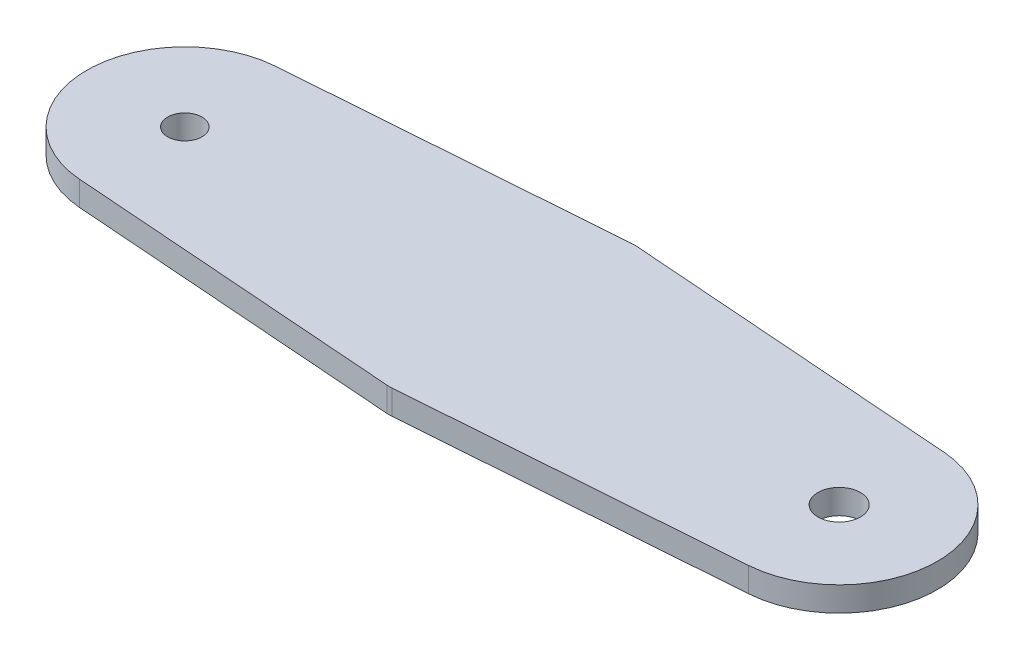
ISO-10303-21;
HEADER;
FILE_DESCRIPTION(('STEP AP214'),'2;1');
FILE_NAME('part.step','',(''),(''),'','','');
FILE_SCHEMA(('AUTOMOTIVE_DESIGN { 1 0 10303 214 1 1 1 1 }'));
ENDSEC;
DATA;
#1=APPLICATION_CONTEXT('core data for automotive mechanical design processes');
#2=APPLICATION_PROTOCOL_DEFINITION('international standard','automotive_design',2000,#1);
#3=PRODUCT_CONTEXT('',#1,'mechanical');
#4=PRODUCT('Part','Part','',(#3));
#5=PRODUCT_RELATED_PRODUCT_CATEGORY('part','',(#4));
#6=PRODUCT_DEFINITION_FORMATION('','',#4);
#7=PRODUCT_DEFINITION_CONTEXT('part definition',#1,'design');
#8=PRODUCT_DEFINITION('design','',#6,#7);
#9=PRODUCT_DEFINITION_SHAPE('','',#8);
#10=(LENGTH_UNIT() NAMED_UNIT(*) SI_UNIT(.MILLI.,.METRE.));
#11=(NAMED_UNIT(*) PLANE_ANGLE_UNIT() SI_UNIT($,.RADIAN.));
#12=(NAMED_UNIT(*) SI_UNIT($,.STERADIAN.) SOLID_ANGLE_UNIT());
#13=UNCERTAINTY_MEASURE_WITH_UNIT(LENGTH_MEASURE(1.E-05),#10,'distance_accuracy_value','');
#14=(GEOMETRIC_REPRESENTATION_CONTEXT(3) GLOBAL_UNCERTAINTY_ASSIGNED_CONTEXT((#13)) GLOBAL_UNIT_ASSIGNED_CONTEXT((#10,
#11,#12)) REPRESENTATION_CONTEXT('',''));
#15=CARTESIAN_POINT('',(0.,0.,0.));
#16=DIRECTION('',(0.,0.,1.));
#17=DIRECTION('',(1.,0.,0.));
#18=AXIS2_PLACEMENT_3D('',#15,#16,#17);
#19=CARTESIAN_POINT('',(0.,3.,0.));
#20=DIRECTION('',(0.,1.,0.));
#21=DIRECTION('',(0.,0.,1.));
#22=AXIS2_PLACEMENT_3D('',#19,#20,#21);
#23=PLANE('',#22);
#24=CARTESIAN_POINT('',(0.,3.,0.));
#25=DIRECTION('',(0.,1.,0.));
#26=DIRECTION('',(0.,0.,1.));
#27=AXIS2_PLACEMENT_3D('',#24,#25,#26);
#28=CIRCLE('',#27,2.1);
#29=CARTESIAN_POINT('',(0.,3.,2.1));
#30=VERTEX_POINT('',#29);
#31=EDGE_CURVE('E219',#30,#30,#28,.T.);
#32=ORIENTED_EDGE('',*,*,#31,.F.);
#33=EDGE_LOOP('',(#32));
#34=FACE_BOUND('',#33,.T.);
#35=DIRECTION('',(0.997260273972603,0.,0.073972602739726));
#36=VECTOR('',#35,1.);
#37=CARTESIAN_POINT('',(-0.887671232876711,3.,11.9671232876712));
#38=LINE('',#37,#36);
#39=CARTESIAN_POINT('',(-0.887671232876711,3.,11.9671232876712));
#40=VERTEX_POINT('',#39);
#41=CARTESIAN_POINT('',(39.7041095890411,3.,14.9780520849014));
#42=VERTEX_POINT('',#41);
#43=EDGE_CURVE('E145',#40,#42,#38,.T.);
#44=ORIENTED_EDGE('',*,*,#43,.T.);
#45=CARTESIAN_POINT('',(40.,3.,10.989010989011));
#46=DIRECTION('',(0.,1.,0.));
#47=DIRECTION('',(0.,0.,1.));
#48=AXIS2_PLACEMENT_3D('',#45,#46,#47);
#49=CIRCLE('',#48,4.);
#50=CARTESIAN_POINT('',(40.2958904109589,3.,14.9780520849014));
#51=VERTEX_POINT('',#50);
#52=EDGE_CURVE('E183',#42,#51,#49,.T.);
#53=ORIENTED_EDGE('',*,*,#52,.T.);
#54=DIRECTION('',(0.997260273972603,0.,-0.0739726027397259));
#55=VECTOR('',#54,1.);
#56=CARTESIAN_POINT('',(40.,3.,15.));
#57=LINE('',#56,#55);
#58=CARTESIAN_POINT('',(80.8876712328767,3.,11.9671232876712));
#59=VERTEX_POINT('',#58);
#60=EDGE_CURVE('E155',#51,#59,#57,.T.);
#61=ORIENTED_EDGE('',*,*,#60,.T.);
#62=CARTESIAN_POINT('',(80.,3.,0.));
#63=DIRECTION('',(0.,-1.,0.));
#64=DIRECTION('',(0.,0.,-1.));
#65=AXIS2_PLACEMENT_3D('',#62,#63,#64);
#66=CIRCLE('',#65,12.);
#67=CARTESIAN_POINT('',(80.8876712328767,3.,-11.9671232876712));
#68=VERTEX_POINT('',#67);
#69=EDGE_CURVE('E222',#68,#59,#66,.T.);
#70=ORIENTED_EDGE('',*,*,#69,.F.);
#71=DIRECTION('',(0.997260273972603,0.,0.0739726027397259));
#72=VECTOR('',#71,1.);
#73=CARTESIAN_POINT('',(40.,3.,-15.));
#74=LINE('',#73,#72);
#75=CARTESIAN_POINT('',(40.2958904109589,3.,-14.9780520849014));
#76=VERTEX_POINT('',#75);
#77=EDGE_CURVE('E206',#76,#68,#74,.T.);
#78=ORIENTED_EDGE('',*,*,#77,.F.);
#79=CARTESIAN_POINT('',(40.,3.,-10.989010989011));
#80=DIRECTION('',(0.,1.,0.));
#81=DIRECTION('',(0.,0.,1.));
#82=AXIS2_PLACEMENT_3D('',#79,#80,#81);
#83=CIRCLE('',#82,4.);
#84=CARTESIAN_POINT('',(39.7041095890411,3.,-14.9780520849014));
#85=VERTEX_POINT('',#84);
#86=EDGE_CURVE('E95',#76,#85,#83,.T.);
#87=ORIENTED_EDGE('',*,*,#86,.T.);
#88=DIRECTION('',(0.997260273972603,0.,-0.0739726027397261));
#89=VECTOR('',#88,1.);
#90=CARTESIAN_POINT('',(-0.887671232876712,3.,-11.9671232876712));
#91=LINE('',#90,#89);
#92=CARTESIAN_POINT('',(-0.887671232876712,3.,-11.9671232876712));
#93=VERTEX_POINT('',#92);
#94=EDGE_CURVE('E160',#93,#85,#91,.T.);
#95=ORIENTED_EDGE('',*,*,#94,.F.);
#96=CARTESIAN_POINT('',(0.,3.,0.));
#97=DIRECTION('',(0.,1.,0.));
#98=DIRECTION('',(0.,0.,1.));
#99=AXIS2_PLACEMENT_3D('',#96,#97,#98);
#100=CIRCLE('',#99,12.);
#101=EDGE_CURVE('E156',#93,#40,#100,.T.);
#102=ORIENTED_EDGE('',*,*,#101,.T.);
#103=EDGE_LOOP('',(#44,#53,#61,#70,#78,#87,#95,#102));
#104=FACE_BOUND('',#103,.T.);
#105=CARTESIAN_POINT('',(80.,3.,0.));
#106=DIRECTION('',(0.,1.,0.));
#107=DIRECTION('',(0.,0.,1.));
#108=AXIS2_PLACEMENT_3D('',#105,#106,#107);
#109=CIRCLE('',#108,2.59999999999999);
#110=CARTESIAN_POINT('',(80.,3.,2.59999999999999));
#111=VERTEX_POINT('',#110);
#112=EDGE_CURVE('E228',#111,#111,#109,.T.);
#113=ORIENTED_EDGE('',*,*,#112,.F.);
#114=EDGE_LOOP('',(#113));
#115=FACE_BOUND('',#114,.T.);
#116=ADVANCED_FACE('F80',(#34,#104,#115),#23,.T.);
#117=CARTESIAN_POINT('',(0.,0.,0.));
#118=DIRECTION('',(0.,1.,0.));
#119=DIRECTION('',(0.,0.,1.));
#120=AXIS2_PLACEMENT_3D('',#117,#118,#119);
#121=PLANE('',#120);
#122=DIRECTION('',(0.997260273972603,0.,-0.0739726027397259));
#123=VECTOR('',#122,1.);
#124=CARTESIAN_POINT('',(40.,0.,15.));
#125=LINE('',#124,#123);
#126=CARTESIAN_POINT('',(40.2958904109589,0.,14.9780520849014));
#127=VERTEX_POINT('',#126);
#128=CARTESIAN_POINT('',(80.8876712328767,0.,11.9671232876712));
#129=VERTEX_POINT('',#128);
#130=EDGE_CURVE('E213',#127,#129,#125,.T.);
#131=ORIENTED_EDGE('',*,*,#130,.F.);
#132=CARTESIAN_POINT('',(40.,0.,10.989010989011));
#133=DIRECTION('',(0.,1.,0.));
#134=DIRECTION('',(0.,0.,1.));
#135=AXIS2_PLACEMENT_3D('',#132,#133,#134);
#136=CIRCLE('',#135,4.);
#137=CARTESIAN_POINT('',(39.7041095890411,0.,14.9780520849014));
#138=VERTEX_POINT('',#137);
#139=EDGE_CURVE('E179',#127,#138,#136,.F.);
#140=ORIENTED_EDGE('',*,*,#139,.T.);
#141=DIRECTION('',(0.997260273972603,0.,0.073972602739726));
#142=VECTOR('',#141,1.);
#143=CARTESIAN_POINT('',(-0.887671232876711,0.,11.9671232876712));
#144=LINE('',#143,#142);
#145=CARTESIAN_POINT('',(-0.887671232876711,0.,11.9671232876712));
#146=VERTEX_POINT('',#145);
#147=EDGE_CURVE('E214',#146,#138,#144,.T.);
#148=ORIENTED_EDGE('',*,*,#147,.F.);
#149=CARTESIAN_POINT('',(0.,0.,0.));
#150=DIRECTION('',(0.,1.,0.));
#151=DIRECTION('',(0.,0.,1.));
#152=AXIS2_PLACEMENT_3D('',#149,#150,#151);
#153=CIRCLE('',#152,12.);
#154=CARTESIAN_POINT('',(-0.887671232876712,0.,-11.9671232876712));
#155=VERTEX_POINT('',#154);
#156=EDGE_CURVE('E166',#155,#146,#153,.T.);
#157=ORIENTED_EDGE('',*,*,#156,.F.);
#158=DIRECTION('',(0.997260273972603,0.,-0.0739726027397261));
#159=VECTOR('',#158,1.);
#160=CARTESIAN_POINT('',(-0.887671232876712,0.,-11.9671232876712));
#161=LINE('',#160,#159);
#162=CARTESIAN_POINT('',(39.7041095890411,0.,-14.9780520849014));
#163=VERTEX_POINT('',#162);
#164=EDGE_CURVE('E162',#155,#163,#161,.T.);
#165=ORIENTED_EDGE('',*,*,#164,.T.);
#166=CARTESIAN_POINT('',(40.,0.,-10.989010989011));
#167=DIRECTION('',(0.,1.,0.));
#168=DIRECTION('',(0.,0.,1.));
#169=AXIS2_PLACEMENT_3D('',#166,#167,#168);
#170=CIRCLE('',#169,4.);
#171=CARTESIAN_POINT('',(40.2958904109589,0.,-14.9780520849014));
#172=VERTEX_POINT('',#171);
#173=EDGE_CURVE('E171',#163,#172,#170,.F.);
#174=ORIENTED_EDGE('',*,*,#173,.T.);
#175=DIRECTION('',(0.997260273972603,0.,0.0739726027397259));
#176=VECTOR('',#175,1.);
#177=CARTESIAN_POINT('',(40.,0.,-15.));
#178=LINE('',#177,#176);
#179=CARTESIAN_POINT('',(80.8876712328767,0.,-11.9671232876712));
#180=VERTEX_POINT('',#179);
#181=EDGE_CURVE('E195',#172,#180,#178,.T.);
#182=ORIENTED_EDGE('',*,*,#181,.T.);
#183=CARTESIAN_POINT('',(80.,0.,0.));
#184=DIRECTION('',(0.,-1.,0.));
#185=DIRECTION('',(0.,0.,-1.));
#186=AXIS2_PLACEMENT_3D('',#183,#184,#185);
#187=CIRCLE('',#186,12.);
#188=EDGE_CURVE('E197',#180,#129,#187,.T.);
#189=ORIENTED_EDGE('',*,*,#188,.T.);
#190=EDGE_LOOP('',(#131,#140,#148,#157,#165,#174,#182,#189));
#191=FACE_BOUND('',#190,.T.);
#192=CARTESIAN_POINT('',(0.,0.,0.));
#193=DIRECTION('',(0.,1.,0.));
#194=DIRECTION('',(0.,0.,1.));
#195=AXIS2_PLACEMENT_3D('',#192,#193,#194);
#196=CIRCLE('',#195,2.1);
#197=CARTESIAN_POINT('',(0.,0.,2.1));
#198=VERTEX_POINT('',#197);
#199=EDGE_CURVE('E225',#198,#198,#196,.T.);
#200=ORIENTED_EDGE('',*,*,#199,.T.);
#201=EDGE_LOOP('',(#200));
#202=FACE_BOUND('',#201,.T.);
#203=CARTESIAN_POINT('',(80.,0.,0.));
#204=DIRECTION('',(0.,1.,0.));
#205=DIRECTION('',(0.,0.,1.));
#206=AXIS2_PLACEMENT_3D('',#203,#204,#205);
#207=CIRCLE('',#206,2.59999999999999);
#208=CARTESIAN_POINT('',(80.,0.,2.59999999999999));
#209=VERTEX_POINT('',#208);
#210=EDGE_CURVE('E231',#209,#209,#207,.T.);
#211=ORIENTED_EDGE('',*,*,#210,.T.);
#212=EDGE_LOOP('',(#211));
#213=FACE_BOUND('',#212,.T.);
#214=ADVANCED_FACE('F193',(#191,#202,#213),#121,.F.);
#215=CARTESIAN_POINT('',(0.,3.,0.));
#216=DIRECTION('',(0.,-1.,0.));
#217=DIRECTION('',(0.,0.,-1.));
#218=AXIS2_PLACEMENT_3D('',#215,#216,#217);
#219=CYLINDRICAL_SURFACE('',#218,12.);
#220=ORIENTED_EDGE('',*,*,#156,.T.);
#221=DIRECTION('',(0.,-1.,0.));
#222=VECTOR('',#221,1.);
#223=CARTESIAN_POINT('',(-0.887671232876711,3.,11.9671232876712));
#224=LINE('',#223,#222);
#225=EDGE_CURVE('E150',#40,#146,#224,.T.);
#226=ORIENTED_EDGE('',*,*,#225,.F.);
#227=ORIENTED_EDGE('',*,*,#101,.F.);
#228=DIRECTION('',(0.,-1.,0.));
#229=VECTOR('',#228,1.);
#230=CARTESIAN_POINT('',(-0.887671232876712,3.,-11.9671232876712));
#231=LINE('',#230,#229);
#232=EDGE_CURVE('E201',#93,#155,#231,.T.);
#233=ORIENTED_EDGE('',*,*,#232,.T.);
#234=EDGE_LOOP('',(#220,#226,#227,#233));
#235=FACE_BOUND('',#234,.T.);
#236=ADVANCED_FACE('F164',(#235),#219,.T.);
#237=CARTESIAN_POINT('',(-0.887671232876711,3.,11.9671232876712));
#238=DIRECTION('',(0.073972602739726,0.,-0.997260273972603));
#239=DIRECTION('',(-0.997260273972603,0.,-0.073972602739726));
#240=AXIS2_PLACEMENT_3D('',#237,#238,#239);
#241=PLANE('',#240);
#242=ORIENTED_EDGE('',*,*,#147,.T.);
#243=DIRECTION('',(0.,-1.,0.));
#244=VECTOR('',#243,1.);
#245=CARTESIAN_POINT('',(39.7041095890411,3.,14.9780520849014));
#246=LINE('',#245,#244);
#247=EDGE_CURVE('E153',#138,#42,#246,.F.);
#248=ORIENTED_EDGE('',*,*,#247,.T.);
#249=ORIENTED_EDGE('',*,*,#43,.F.);
#250=ORIENTED_EDGE('',*,*,#225,.T.);
#251=EDGE_LOOP('',(#242,#248,#249,#250));
#252=FACE_BOUND('',#251,.T.);
#253=ADVANCED_FACE('F148',(#252),#241,.F.);
#254=CARTESIAN_POINT('',(40.,3.,15.));
#255=DIRECTION('',(-0.0739726027397259,0.,-0.997260273972603));
#256=DIRECTION('',(-0.997260273972603,0.,0.0739726027397259));
#257=AXIS2_PLACEMENT_3D('',#254,#255,#256);
#258=PLANE('',#257);
#259=ORIENTED_EDGE('',*,*,#60,.F.);
#260=DIRECTION('',(0.,-1.,0.));
#261=VECTOR('',#260,1.);
#262=CARTESIAN_POINT('',(40.2958904109589,3.,14.9780520849014));
#263=LINE('',#262,#261);
#264=EDGE_CURVE('E167',#51,#127,#263,.T.);
#265=ORIENTED_EDGE('',*,*,#264,.T.);
#266=ORIENTED_EDGE('',*,*,#130,.T.);
#267=DIRECTION('',(0.,-1.,0.));
#268=VECTOR('',#267,1.);
#269=CARTESIAN_POINT('',(80.8876712328767,3.,11.9671232876712));
#270=LINE('',#269,#268);
#271=EDGE_CURVE('E168',#59,#129,#270,.T.);
#272=ORIENTED_EDGE('',*,*,#271,.F.);
#273=EDGE_LOOP('',(#259,#265,#266,#272));
#274=FACE_BOUND('',#273,.T.);
#275=ADVANCED_FACE('F257',(#274),#258,.F.);
#276=CARTESIAN_POINT('',(80.,3.,0.));
#277=DIRECTION('',(0.,-1.,0.));
#278=DIRECTION('',(0.,0.,-1.));
#279=AXIS2_PLACEMENT_3D('',#276,#277,#278);
#280=CYLINDRICAL_SURFACE('',#279,12.);
#281=ORIENTED_EDGE('',*,*,#188,.F.);
#282=DIRECTION('',(0.,-1.,0.));
#283=VECTOR('',#282,1.);
#284=CARTESIAN_POINT('',(80.8876712328767,3.,-11.9671232876712));
#285=LINE('',#284,#283);
#286=EDGE_CURVE('E174',#68,#180,#285,.T.);
#287=ORIENTED_EDGE('',*,*,#286,.F.);
#288=ORIENTED_EDGE('',*,*,#69,.T.);
#289=ORIENTED_EDGE('',*,*,#271,.T.);
#290=EDGE_LOOP('',(#281,#287,#288,#289));
#291=FACE_BOUND('',#290,.T.);
#292=ADVANCED_FACE('F211',(#291),#280,.T.);
#293=CARTESIAN_POINT('',(40.,3.,-15.));
#294=DIRECTION('',(0.0739726027397259,0.,-0.997260273972603));
#295=DIRECTION('',(-0.997260273972603,0.,-0.0739726027397259));
#296=AXIS2_PLACEMENT_3D('',#293,#294,#295);
#297=PLANE('',#296);
#298=ORIENTED_EDGE('',*,*,#181,.F.);
#299=DIRECTION('',(0.,-1.,0.));
#300=VECTOR('',#299,1.);
#301=CARTESIAN_POINT('',(40.2958904109589,3.,-14.9780520849014));
#302=LINE('',#301,#300);
#303=EDGE_CURVE('E12',#172,#76,#302,.F.);
#304=ORIENTED_EDGE('',*,*,#303,.T.);
#305=ORIENTED_EDGE('',*,*,#77,.T.);
#306=ORIENTED_EDGE('',*,*,#286,.T.);
#307=EDGE_LOOP('',(#298,#304,#305,#306));
#308=FACE_BOUND('',#307,.T.);
#309=ADVANCED_FACE('F205',(#308),#297,.T.);
#310=CARTESIAN_POINT('',(-0.887671232876712,3.,-11.9671232876712));
#311=DIRECTION('',(-0.0739726027397261,0.,-0.997260273972603));
#312=DIRECTION('',(-0.997260273972603,0.,0.0739726027397261));
#313=AXIS2_PLACEMENT_3D('',#310,#311,#312);
#314=PLANE('',#313);
#315=ORIENTED_EDGE('',*,*,#94,.T.);
#316=DIRECTION('',(0.,-1.,0.));
#317=VECTOR('',#316,1.);
#318=CARTESIAN_POINT('',(39.7041095890411,3.,-14.9780520849014));
#319=LINE('',#318,#317);
#320=EDGE_CURVE('E88',#85,#163,#319,.T.);
#321=ORIENTED_EDGE('',*,*,#320,.T.);
#322=ORIENTED_EDGE('',*,*,#164,.F.);
#323=ORIENTED_EDGE('',*,*,#232,.F.);
#324=EDGE_LOOP('',(#315,#321,#322,#323));
#325=FACE_BOUND('',#324,.T.);
#326=ADVANCED_FACE('F189',(#325),#314,.T.);
#327=CARTESIAN_POINT('',(0.,3.,0.));
#328=DIRECTION('',(0.,-1.,0.));
#329=DIRECTION('',(0.,0.,-1.));
#330=AXIS2_PLACEMENT_3D('',#327,#328,#329);
#331=CYLINDRICAL_SURFACE('',#330,2.1);
#332=ORIENTED_EDGE('',*,*,#31,.T.);
#333=EDGE_LOOP('',(#332));
#334=FACE_BOUND('',#333,.T.);
#335=ORIENTED_EDGE('',*,*,#199,.F.);
#336=EDGE_LOOP('',(#335));
#337=FACE_BOUND('',#336,.T.);
#338=ADVANCED_FACE('F248',(#334,#337),#331,.F.);
#339=CARTESIAN_POINT('',(80.,3.,0.));
#340=DIRECTION('',(0.,-1.,0.));
#341=DIRECTION('',(0.,0.,-1.));
#342=AXIS2_PLACEMENT_3D('',#339,#340,#341);
#343=CYLINDRICAL_SURFACE('',#342,2.59999999999999);
#344=ORIENTED_EDGE('',*,*,#112,.T.);
#345=EDGE_LOOP('',(#344));
#346=FACE_BOUND('',#345,.T.);
#347=ORIENTED_EDGE('',*,*,#210,.F.);
#348=EDGE_LOOP('',(#347));
#349=FACE_BOUND('',#348,.T.);
#350=ADVANCED_FACE('F237',(#346,#349),#343,.F.);
#351=CARTESIAN_POINT('',(40.,3.,10.989010989011));
#352=DIRECTION('',(0.,-1.,0.));
#353=DIRECTION('',(0.,0.,-1.));
#354=AXIS2_PLACEMENT_3D('',#351,#352,#353);
#355=CYLINDRICAL_SURFACE('',#354,4.);
#356=ORIENTED_EDGE('',*,*,#52,.F.);
#357=ORIENTED_EDGE('',*,*,#247,.F.);
#358=ORIENTED_EDGE('',*,*,#139,.F.);
#359=ORIENTED_EDGE('',*,*,#264,.F.);
#360=EDGE_LOOP('',(#356,#357,#358,#359));
#361=FACE_BOUND('',#360,.T.);
#362=ADVANCED_FACE('F264',(#361),#355,.T.);
#363=CARTESIAN_POINT('',(40.,3.,-10.989010989011));
#364=DIRECTION('',(0.,-1.,0.));
#365=DIRECTION('',(0.,0.,-1.));
#366=AXIS2_PLACEMENT_3D('',#363,#364,#365);
#367=CYLINDRICAL_SURFACE('',#366,4.);
#368=ORIENTED_EDGE('',*,*,#86,.F.);
#369=ORIENTED_EDGE('',*,*,#303,.F.);
#370=ORIENTED_EDGE('',*,*,#173,.F.);
#371=ORIENTED_EDGE('',*,*,#320,.F.);
#372=EDGE_LOOP('',(#368,#369,#370,#371));
#373=FACE_BOUND('',#372,.T.);
#374=ADVANCED_FACE('F82',(#373),#367,.T.);
#375=CLOSED_SHELL('',(#116,#214,#236,#253,#275,#292,#309,#326,#338,#350,#362,#374));
#376=MANIFOLD_SOLID_BREP('B2',#375);
#377=ADVANCED_BREP_SHAPE_REPRESENTATION('',(#18,#376),#14);
#378=SHAPE_DEFINITION_REPRESENTATION(#9,#377);
ENDSEC;
END-ISO-10303-21;
